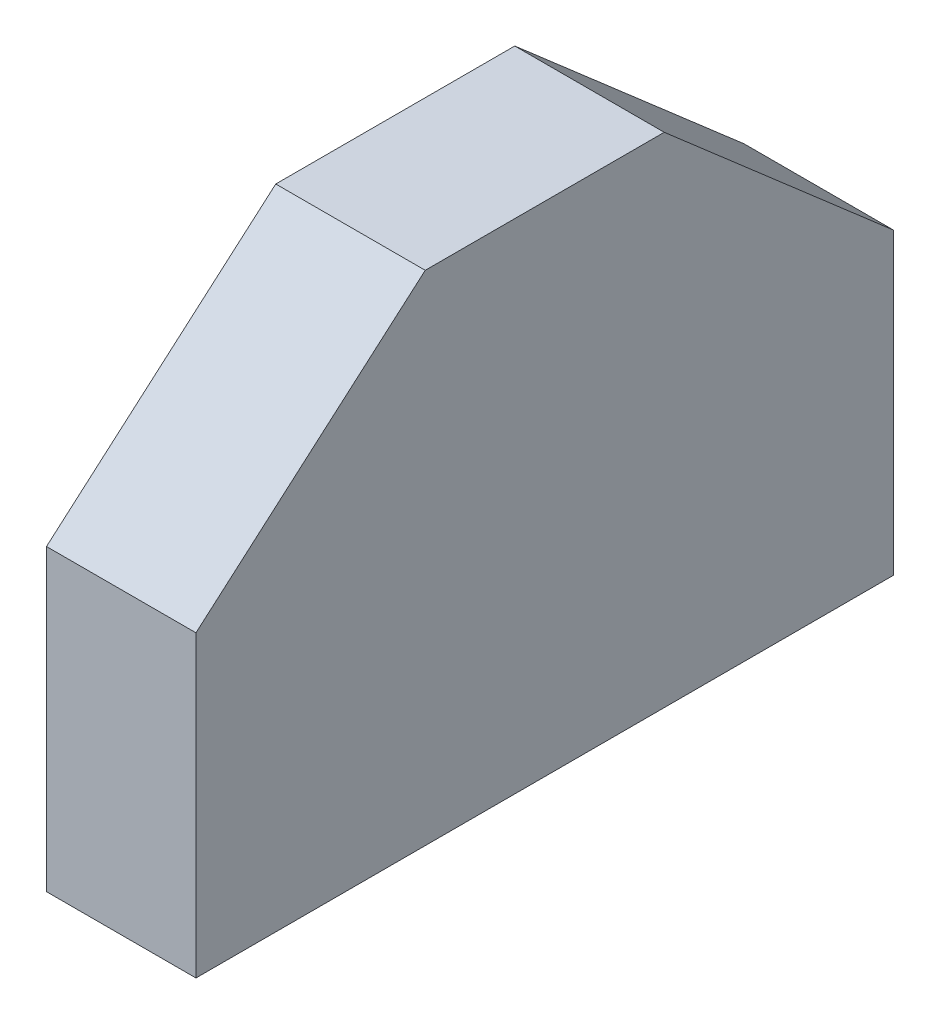
ISO-10303-21;
HEADER;
FILE_DESCRIPTION(('STEP AP214'),'2;1');
FILE_NAME('part.step','',(''),(''),'','','');
FILE_SCHEMA(('AUTOMOTIVE_DESIGN { 1 0 10303 214 1 1 1 1 }'));
ENDSEC;
DATA;
#1=APPLICATION_CONTEXT('core data for automotive mechanical design processes');
#2=APPLICATION_PROTOCOL_DEFINITION('international standard','automotive_design',2000,#1);
#3=PRODUCT_CONTEXT('',#1,'mechanical');
#4=PRODUCT('Part','Part','',(#3));
#5=PRODUCT_RELATED_PRODUCT_CATEGORY('part','',(#4));
#6=PRODUCT_DEFINITION_FORMATION('','',#4);
#7=PRODUCT_DEFINITION_CONTEXT('part definition',#1,'design');
#8=PRODUCT_DEFINITION('design','',#6,#7);
#9=PRODUCT_DEFINITION_SHAPE('','',#8);
#10=(LENGTH_UNIT() NAMED_UNIT(*) SI_UNIT(.MILLI.,.METRE.));
#11=(NAMED_UNIT(*) PLANE_ANGLE_UNIT() SI_UNIT($,.RADIAN.));
#12=(NAMED_UNIT(*) SI_UNIT($,.STERADIAN.) SOLID_ANGLE_UNIT());
#13=UNCERTAINTY_MEASURE_WITH_UNIT(LENGTH_MEASURE(1.E-05),#10,'distance_accuracy_value','');
#14=(GEOMETRIC_REPRESENTATION_CONTEXT(3) GLOBAL_UNCERTAINTY_ASSIGNED_CONTEXT((#13)) GLOBAL_UNIT_ASSIGNED_CONTEXT((#10,
#11,#12)) REPRESENTATION_CONTEXT('',''));
#15=CARTESIAN_POINT('',(0.,0.,0.));
#16=DIRECTION('',(0.,0.,1.));
#17=DIRECTION('',(1.,0.,0.));
#18=AXIS2_PLACEMENT_3D('',#15,#16,#17);
#19=CARTESIAN_POINT('',(-7.5,50.,35.));
#20=DIRECTION('',(1.,0.,0.));
#21=DIRECTION('',(0.,0.,-1.));
#22=AXIS2_PLACEMENT_3D('',#19,#20,#21);
#23=PLANE('',#22);
#24=DIRECTION('',(0.,0.,1.));
#25=VECTOR('',#24,1.);
#26=CARTESIAN_POINT('',(-7.5,50.,35.));
#27=LINE('',#26,#25);
#28=CARTESIAN_POINT('',(-7.5,50.,-11.9926318555798));
#29=VERTEX_POINT('',#28);
#30=CARTESIAN_POINT('',(-7.5,50.,11.9926318555798));
#31=VERTEX_POINT('',#30);
#32=EDGE_CURVE('E174',#29,#31,#27,.T.);
#33=ORIENTED_EDGE('',*,*,#32,.F.);
#34=DIRECTION('',(0.,-0.656059028990508,-0.754709580222771));
#35=VECTOR('',#34,1.);
#36=CARTESIAN_POINT('',(-7.5,50.,-11.9926318555798));
#37=LINE('',#36,#35);
#38=CARTESIAN_POINT('',(-7.5,29.9999999999999,-35.));
#39=VERTEX_POINT('',#38);
#40=EDGE_CURVE('E220',#29,#39,#37,.T.);
#41=ORIENTED_EDGE('',*,*,#40,.T.);
#42=DIRECTION('',(0.,-1.,0.));
#43=VECTOR('',#42,1.);
#44=CARTESIAN_POINT('',(-7.5,50.,-35.));
#45=LINE('',#44,#43);
#46=CARTESIAN_POINT('',(-7.5,0.,-35.));
#47=VERTEX_POINT('',#46);
#48=EDGE_CURVE('E183',#39,#47,#45,.T.);
#49=ORIENTED_EDGE('',*,*,#48,.T.);
#50=DIRECTION('',(0.,0.,1.));
#51=VECTOR('',#50,1.);
#52=CARTESIAN_POINT('',(-7.5,0.,35.));
#53=LINE('',#52,#51);
#54=CARTESIAN_POINT('',(-7.5,0.,35.));
#55=VERTEX_POINT('',#54);
#56=EDGE_CURVE('E168',#47,#55,#53,.T.);
#57=ORIENTED_EDGE('',*,*,#56,.T.);
#58=DIRECTION('',(0.,-1.,0.));
#59=VECTOR('',#58,1.);
#60=CARTESIAN_POINT('',(-7.5,50.,35.));
#61=LINE('',#60,#59);
#62=CARTESIAN_POINT('',(-7.5,29.9999999999999,35.));
#63=VERTEX_POINT('',#62);
#64=EDGE_CURVE('E206',#63,#55,#61,.T.);
#65=ORIENTED_EDGE('',*,*,#64,.F.);
#66=DIRECTION('',(0.,0.656059028990509,-0.754709580222771));
#67=VECTOR('',#66,1.);
#68=CARTESIAN_POINT('',(-7.5,50.,11.9926318555798));
#69=LINE('',#68,#67);
#70=EDGE_CURVE('E217',#63,#31,#69,.T.);
#71=ORIENTED_EDGE('',*,*,#70,.T.);
#72=EDGE_LOOP('',(#33,#41,#49,#57,#65,#71));
#73=FACE_BOUND('',#72,.T.);
#74=ADVANCED_FACE('F45',(#73),#23,.F.);
#75=CARTESIAN_POINT('',(7.5,50.,35.));
#76=DIRECTION('',(0.,0.,-1.));
#77=DIRECTION('',(-1.,0.,0.));
#78=AXIS2_PLACEMENT_3D('',#75,#76,#77);
#79=PLANE('',#78);
#80=DIRECTION('',(0.,-1.,0.));
#81=VECTOR('',#80,1.);
#82=CARTESIAN_POINT('',(7.5,50.,35.));
#83=LINE('',#82,#81);
#84=CARTESIAN_POINT('',(7.5,29.9999999999999,35.));
#85=VERTEX_POINT('',#84);
#86=CARTESIAN_POINT('',(7.5,0.,35.));
#87=VERTEX_POINT('',#86);
#88=EDGE_CURVE('E203',#85,#87,#83,.T.);
#89=ORIENTED_EDGE('',*,*,#88,.F.);
#90=DIRECTION('',(-1.,0.,0.));
#91=VECTOR('',#90,1.);
#92=CARTESIAN_POINT('',(-7.5,29.9999999999999,35.));
#93=LINE('',#92,#91);
#94=EDGE_CURVE('E11',#85,#63,#93,.T.);
#95=ORIENTED_EDGE('',*,*,#94,.T.);
#96=ORIENTED_EDGE('',*,*,#64,.T.);
#97=DIRECTION('',(1.,0.,0.));
#98=VECTOR('',#97,1.);
#99=CARTESIAN_POINT('',(7.5,0.,35.));
#100=LINE('',#99,#98);
#101=EDGE_CURVE('E187',#55,#87,#100,.T.);
#102=ORIENTED_EDGE('',*,*,#101,.T.);
#103=EDGE_LOOP('',(#89,#95,#96,#102));
#104=FACE_BOUND('',#103,.T.);
#105=ADVANCED_FACE('F254',(#104),#79,.F.);
#106=CARTESIAN_POINT('',(7.5,50.,35.));
#107=DIRECTION('',(-1.,0.,0.));
#108=DIRECTION('',(0.,0.,1.));
#109=AXIS2_PLACEMENT_3D('',#106,#107,#108);
#110=PLANE('',#109);
#111=DIRECTION('',(0.,-1.,0.));
#112=VECTOR('',#111,1.);
#113=CARTESIAN_POINT('',(7.5,50.,-35.));
#114=LINE('',#113,#112);
#115=CARTESIAN_POINT('',(7.5,29.9999999999999,-35.));
#116=VERTEX_POINT('',#115);
#117=CARTESIAN_POINT('',(7.5,0.,-35.));
#118=VERTEX_POINT('',#117);
#119=EDGE_CURVE('E200',#116,#118,#114,.T.);
#120=ORIENTED_EDGE('',*,*,#119,.F.);
#121=DIRECTION('',(0.,0.656059028990508,0.754709580222771));
#122=VECTOR('',#121,1.);
#123=CARTESIAN_POINT('',(7.5,50.,-11.9926318555798));
#124=LINE('',#123,#122);
#125=CARTESIAN_POINT('',(7.5,50.,-11.9926318555798));
#126=VERTEX_POINT('',#125);
#127=EDGE_CURVE('E55',#116,#126,#124,.T.);
#128=ORIENTED_EDGE('',*,*,#127,.T.);
#129=DIRECTION('',(0.,0.,-1.));
#130=VECTOR('',#129,1.);
#131=CARTESIAN_POINT('',(7.5,50.,35.));
#132=LINE('',#131,#130);
#133=CARTESIAN_POINT('',(7.5,50.,11.9926318555798));
#134=VERTEX_POINT('',#133);
#135=EDGE_CURVE('E178',#134,#126,#132,.T.);
#136=ORIENTED_EDGE('',*,*,#135,.F.);
#137=DIRECTION('',(0.,-0.656059028990509,0.754709580222771));
#138=VECTOR('',#137,1.);
#139=CARTESIAN_POINT('',(7.5,50.,11.9926318555798));
#140=LINE('',#139,#138);
#141=EDGE_CURVE('E70',#134,#85,#140,.T.);
#142=ORIENTED_EDGE('',*,*,#141,.T.);
#143=ORIENTED_EDGE('',*,*,#88,.T.);
#144=DIRECTION('',(0.,0.,-1.));
#145=VECTOR('',#144,1.);
#146=CARTESIAN_POINT('',(7.5,0.,35.));
#147=LINE('',#146,#145);
#148=EDGE_CURVE('E191',#87,#118,#147,.T.);
#149=ORIENTED_EDGE('',*,*,#148,.T.);
#150=EDGE_LOOP('',(#120,#128,#136,#142,#143,#149));
#151=FACE_BOUND('',#150,.T.);
#152=ADVANCED_FACE('F230',(#151),#110,.F.);
#153=CARTESIAN_POINT('',(7.5,50.,-35.));
#154=DIRECTION('',(0.,0.,1.));
#155=DIRECTION('',(1.,0.,0.));
#156=AXIS2_PLACEMENT_3D('',#153,#154,#155);
#157=PLANE('',#156);
#158=ORIENTED_EDGE('',*,*,#48,.F.);
#159=DIRECTION('',(1.,0.,0.));
#160=VECTOR('',#159,1.);
#161=CARTESIAN_POINT('',(7.5,29.9999999999999,-35.));
#162=LINE('',#161,#160);
#163=EDGE_CURVE('E223',#39,#116,#162,.T.);
#164=ORIENTED_EDGE('',*,*,#163,.T.);
#165=ORIENTED_EDGE('',*,*,#119,.T.);
#166=DIRECTION('',(-1.,0.,0.));
#167=VECTOR('',#166,1.);
#168=CARTESIAN_POINT('',(7.5,0.,-35.));
#169=LINE('',#168,#167);
#170=EDGE_CURVE('E179',#118,#47,#169,.T.);
#171=ORIENTED_EDGE('',*,*,#170,.T.);
#172=EDGE_LOOP('',(#158,#164,#165,#171));
#173=FACE_BOUND('',#172,.T.);
#174=ADVANCED_FACE('F242',(#173),#157,.F.);
#175=CARTESIAN_POINT('',(0.,50.,0.));
#176=DIRECTION('',(0.,1.,0.));
#177=DIRECTION('',(0.,0.,1.));
#178=AXIS2_PLACEMENT_3D('',#175,#176,#177);
#179=PLANE('',#178);
#180=ORIENTED_EDGE('',*,*,#135,.T.);
#181=DIRECTION('',(-1.,0.,0.));
#182=VECTOR('',#181,1.);
#183=CARTESIAN_POINT('',(-7.5,50.,-11.9926318555798));
#184=LINE('',#183,#182);
#185=EDGE_CURVE('E213',#126,#29,#184,.T.);
#186=ORIENTED_EDGE('',*,*,#185,.T.);
#187=ORIENTED_EDGE('',*,*,#32,.T.);
#188=DIRECTION('',(1.,0.,0.));
#189=VECTOR('',#188,1.);
#190=CARTESIAN_POINT('',(7.5,50.,11.9926318555798));
#191=LINE('',#190,#189);
#192=EDGE_CURVE('E209',#31,#134,#191,.T.);
#193=ORIENTED_EDGE('',*,*,#192,.T.);
#194=EDGE_LOOP('',(#180,#186,#187,#193));
#195=FACE_BOUND('',#194,.T.);
#196=ADVANCED_FACE('F235',(#195),#179,.T.);
#197=CARTESIAN_POINT('',(0.,0.,0.));
#198=DIRECTION('',(0.,1.,0.));
#199=DIRECTION('',(0.,0.,1.));
#200=AXIS2_PLACEMENT_3D('',#197,#198,#199);
#201=PLANE('',#200);
#202=DIRECTION('',(0.,0.,-1.));
#203=VECTOR('',#202,1.);
#204=CARTESIAN_POINT('',(-4.5,0.,32.));
#205=LINE('',#204,#203);
#206=CARTESIAN_POINT('',(-4.5,0.,32.));
#207=VERTEX_POINT('',#206);
#208=CARTESIAN_POINT('',(-4.5,0.,-32.));
#209=VERTEX_POINT('',#208);
#210=EDGE_CURVE('E159',#207,#209,#205,.T.);
#211=ORIENTED_EDGE('',*,*,#210,.F.);
#212=DIRECTION('',(-1.,0.,0.));
#213=VECTOR('',#212,1.);
#214=CARTESIAN_POINT('',(4.5,0.,32.));
#215=LINE('',#214,#213);
#216=CARTESIAN_POINT('',(4.5,0.,32.));
#217=VERTEX_POINT('',#216);
#218=EDGE_CURVE('E62',#217,#207,#215,.T.);
#219=ORIENTED_EDGE('',*,*,#218,.F.);
#220=DIRECTION('',(0.,0.,1.));
#221=VECTOR('',#220,1.);
#222=CARTESIAN_POINT('',(4.5,0.,-32.));
#223=LINE('',#222,#221);
#224=CARTESIAN_POINT('',(4.5,0.,-32.));
#225=VERTEX_POINT('',#224);
#226=EDGE_CURVE('E146',#225,#217,#223,.T.);
#227=ORIENTED_EDGE('',*,*,#226,.F.);
#228=DIRECTION('',(1.,0.,0.));
#229=VECTOR('',#228,1.);
#230=CARTESIAN_POINT('',(-4.5,0.,-32.));
#231=LINE('',#230,#229);
#232=EDGE_CURVE('E150',#209,#225,#231,.T.);
#233=ORIENTED_EDGE('',*,*,#232,.F.);
#234=EDGE_LOOP('',(#211,#219,#227,#233));
#235=FACE_BOUND('',#234,.T.);
#236=ORIENTED_EDGE('',*,*,#56,.F.);
#237=ORIENTED_EDGE('',*,*,#170,.F.);
#238=ORIENTED_EDGE('',*,*,#148,.F.);
#239=ORIENTED_EDGE('',*,*,#101,.F.);
#240=EDGE_LOOP('',(#236,#237,#238,#239));
#241=FACE_BOUND('',#240,.T.);
#242=ADVANCED_FACE('F248',(#235,#241),#201,.F.);
#243=CARTESIAN_POINT('',(0.,50.,-11.9926318555798));
#244=DIRECTION('',(0.,0.754709580222771,-0.656059028990508));
#245=DIRECTION('',(1.,0.,0.));
#246=AXIS2_PLACEMENT_3D('',#243,#244,#245);
#247=PLANE('',#246);
#248=ORIENTED_EDGE('',*,*,#127,.F.);
#249=ORIENTED_EDGE('',*,*,#163,.F.);
#250=ORIENTED_EDGE('',*,*,#40,.F.);
#251=ORIENTED_EDGE('',*,*,#185,.F.);
#252=EDGE_LOOP('',(#248,#249,#250,#251));
#253=FACE_BOUND('',#252,.T.);
#254=ADVANCED_FACE('F238',(#253),#247,.T.);
#255=CARTESIAN_POINT('',(0.,50.,11.9926318555798));
#256=DIRECTION('',(0.,0.754709580222771,0.656059028990509));
#257=DIRECTION('',(-1.,0.,0.));
#258=AXIS2_PLACEMENT_3D('',#255,#256,#257);
#259=PLANE('',#258);
#260=ORIENTED_EDGE('',*,*,#70,.F.);
#261=ORIENTED_EDGE('',*,*,#94,.F.);
#262=ORIENTED_EDGE('',*,*,#141,.F.);
#263=ORIENTED_EDGE('',*,*,#192,.F.);
#264=EDGE_LOOP('',(#260,#261,#262,#263));
#265=FACE_BOUND('',#264,.T.);
#266=ADVANCED_FACE('F48',(#265),#259,.T.);
#267=CARTESIAN_POINT('',(4.5,29.9999999999999,32.));
#268=DIRECTION('',(0.,0.,1.));
#269=DIRECTION('',(1.,0.,0.));
#270=AXIS2_PLACEMENT_3D('',#267,#268,#269);
#271=PLANE('',#270);
#272=ORIENTED_EDGE('',*,*,#218,.T.);
#273=DIRECTION('',(0.,-1.,0.));
#274=VECTOR('',#273,1.);
#275=CARTESIAN_POINT('',(-4.5,29.9999999999999,32.));
#276=LINE('',#275,#274);
#277=CARTESIAN_POINT('',(-4.5,29.9999999999999,32.));
#278=VERTEX_POINT('',#277);
#279=EDGE_CURVE('E121',#278,#207,#276,.T.);
#280=ORIENTED_EDGE('',*,*,#279,.F.);
#281=DIRECTION('',(-1.,0.,0.));
#282=VECTOR('',#281,1.);
#283=CARTESIAN_POINT('',(4.5,29.9999999999999,32.));
#284=LINE('',#283,#282);
#285=CARTESIAN_POINT('',(4.5,29.9999999999999,32.));
#286=VERTEX_POINT('',#285);
#287=EDGE_CURVE('E125',#286,#278,#284,.T.);
#288=ORIENTED_EDGE('',*,*,#287,.F.);
#289=DIRECTION('',(0.,-1.,0.));
#290=VECTOR('',#289,1.);
#291=CARTESIAN_POINT('',(4.5,29.9999999999999,32.));
#292=LINE('',#291,#290);
#293=EDGE_CURVE('E165',#286,#217,#292,.T.);
#294=ORIENTED_EDGE('',*,*,#293,.T.);
#295=EDGE_LOOP('',(#272,#280,#288,#294));
#296=FACE_BOUND('',#295,.T.);
#297=ADVANCED_FACE('F123',(#296),#271,.F.);
#298=CARTESIAN_POINT('',(4.5,29.9999999999999,-32.));
#299=DIRECTION('',(1.,0.,0.));
#300=DIRECTION('',(0.,0.,-1.));
#301=AXIS2_PLACEMENT_3D('',#298,#299,#300);
#302=PLANE('',#301);
#303=ORIENTED_EDGE('',*,*,#226,.T.);
#304=ORIENTED_EDGE('',*,*,#293,.F.);
#305=DIRECTION('',(0.,0.,1.));
#306=VECTOR('',#305,1.);
#307=CARTESIAN_POINT('',(4.5,29.9999999999999,-32.));
#308=LINE('',#307,#306);
#309=CARTESIAN_POINT('',(4.5,29.9999999999999,-32.));
#310=VERTEX_POINT('',#309);
#311=EDGE_CURVE('E132',#310,#286,#308,.T.);
#312=ORIENTED_EDGE('',*,*,#311,.F.);
#313=DIRECTION('',(0.,-1.,0.));
#314=VECTOR('',#313,1.);
#315=CARTESIAN_POINT('',(4.5,29.9999999999999,-32.));
#316=LINE('',#315,#314);
#317=EDGE_CURVE('E169',#310,#225,#316,.T.);
#318=ORIENTED_EDGE('',*,*,#317,.T.);
#319=EDGE_LOOP('',(#303,#304,#312,#318));
#320=FACE_BOUND('',#319,.T.);
#321=ADVANCED_FACE('F315',(#320),#302,.F.);
#322=CARTESIAN_POINT('',(-4.5,29.9999999999999,-32.));
#323=DIRECTION('',(0.,0.,-1.));
#324=DIRECTION('',(-1.,0.,0.));
#325=AXIS2_PLACEMENT_3D('',#322,#323,#324);
#326=PLANE('',#325);
#327=ORIENTED_EDGE('',*,*,#232,.T.);
#328=ORIENTED_EDGE('',*,*,#317,.F.);
#329=DIRECTION('',(1.,0.,0.));
#330=VECTOR('',#329,1.);
#331=CARTESIAN_POINT('',(-4.5,29.9999999999999,-32.));
#332=LINE('',#331,#330);
#333=CARTESIAN_POINT('',(-4.5,29.9999999999999,-32.));
#334=VERTEX_POINT('',#333);
#335=EDGE_CURVE('E141',#334,#310,#332,.T.);
#336=ORIENTED_EDGE('',*,*,#335,.F.);
#337=DIRECTION('',(0.,-1.,0.));
#338=VECTOR('',#337,1.);
#339=CARTESIAN_POINT('',(-4.5,29.9999999999999,-32.));
#340=LINE('',#339,#338);
#341=EDGE_CURVE('E131',#334,#209,#340,.T.);
#342=ORIENTED_EDGE('',*,*,#341,.T.);
#343=EDGE_LOOP('',(#327,#328,#336,#342));
#344=FACE_BOUND('',#343,.T.);
#345=ADVANCED_FACE('F324',(#344),#326,.F.);
#346=CARTESIAN_POINT('',(-4.5,29.9999999999999,32.));
#347=DIRECTION('',(-1.,0.,0.));
#348=DIRECTION('',(0.,0.,1.));
#349=AXIS2_PLACEMENT_3D('',#346,#347,#348);
#350=PLANE('',#349);
#351=ORIENTED_EDGE('',*,*,#210,.T.);
#352=ORIENTED_EDGE('',*,*,#341,.F.);
#353=DIRECTION('',(0.,0.,-1.));
#354=VECTOR('',#353,1.);
#355=CARTESIAN_POINT('',(-4.5,29.9999999999999,32.));
#356=LINE('',#355,#354);
#357=EDGE_CURVE('E135',#278,#334,#356,.T.);
#358=ORIENTED_EDGE('',*,*,#357,.F.);
#359=ORIENTED_EDGE('',*,*,#279,.T.);
#360=EDGE_LOOP('',(#351,#352,#358,#359));
#361=FACE_BOUND('',#360,.T.);
#362=ADVANCED_FACE('F136',(#361),#350,.F.);
#363=CARTESIAN_POINT('',(0.,29.9999999999999,0.));
#364=DIRECTION('',(0.,-1.,0.));
#365=DIRECTION('',(0.,0.,-1.));
#366=AXIS2_PLACEMENT_3D('',#363,#364,#365);
#367=PLANE('',#366);
#368=ORIENTED_EDGE('',*,*,#287,.T.);
#369=ORIENTED_EDGE('',*,*,#357,.T.);
#370=ORIENTED_EDGE('',*,*,#335,.T.);
#371=ORIENTED_EDGE('',*,*,#311,.T.);
#372=EDGE_LOOP('',(#368,#369,#370,#371));
#373=FACE_BOUND('',#372,.T.);
#374=ADVANCED_FACE('F143',(#373),#367,.T.);
#375=CLOSED_SHELL('',(#74,#105,#152,#174,#196,#242,#254,#266,#297,#321,#345,#362,#374));
#376=MANIFOLD_SOLID_BREP('B2',#375);
#377=ADVANCED_BREP_SHAPE_REPRESENTATION('',(#18,#376),#14);
#378=SHAPE_DEFINITION_REPRESENTATION(#9,#377);
ENDSEC;
END-ISO-10303-21;
